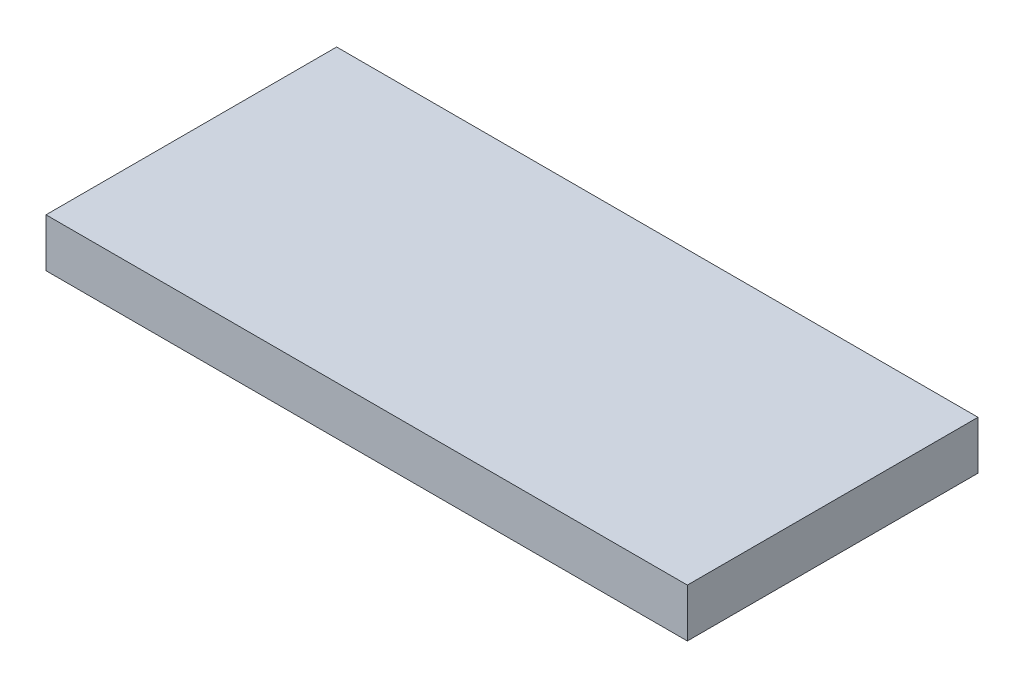
ISO-10303-21;
HEADER;
FILE_DESCRIPTION(('STEP AP214'),'2;1');
FILE_NAME('part.step','',(''),(''),'','','');
FILE_SCHEMA(('AUTOMOTIVE_DESIGN { 1 0 10303 214 1 1 1 1 }'));
ENDSEC;
DATA;
#1=APPLICATION_CONTEXT('core data for automotive mechanical design processes');
#2=APPLICATION_PROTOCOL_DEFINITION('international standard','automotive_design',2000,#1);
#3=PRODUCT_CONTEXT('',#1,'mechanical');
#4=PRODUCT('Part','Part','',(#3));
#5=PRODUCT_RELATED_PRODUCT_CATEGORY('part','',(#4));
#6=PRODUCT_DEFINITION_FORMATION('','',#4);
#7=PRODUCT_DEFINITION_CONTEXT('part definition',#1,'design');
#8=PRODUCT_DEFINITION('design','',#6,#7);
#9=PRODUCT_DEFINITION_SHAPE('','',#8);
#10=(LENGTH_UNIT() NAMED_UNIT(*) SI_UNIT(.MILLI.,.METRE.));
#11=(NAMED_UNIT(*) PLANE_ANGLE_UNIT() SI_UNIT($,.RADIAN.));
#12=(NAMED_UNIT(*) SI_UNIT($,.STERADIAN.) SOLID_ANGLE_UNIT());
#13=UNCERTAINTY_MEASURE_WITH_UNIT(LENGTH_MEASURE(1.E-05),#10,'distance_accuracy_value','');
#14=(GEOMETRIC_REPRESENTATION_CONTEXT(3) GLOBAL_UNCERTAINTY_ASSIGNED_CONTEXT((#13)) GLOBAL_UNIT_ASSIGNED_CONTEXT((#10,
#11,#12)) REPRESENTATION_CONTEXT('',''));
#15=CARTESIAN_POINT('',(0.,0.,0.));
#16=DIRECTION('',(0.,0.,1.));
#17=DIRECTION('',(1.,0.,0.));
#18=AXIS2_PLACEMENT_3D('',#15,#16,#17);
#19=CARTESIAN_POINT('',(0.,6.35,0.));
#20=DIRECTION('',(1.,0.,0.));
#21=DIRECTION('',(0.,0.,-1.));
#22=AXIS2_PLACEMENT_3D('',#19,#20,#21);
#23=PLANE('',#22);
#24=DIRECTION('',(0.,0.,1.));
#25=VECTOR('',#24,1.);
#26=CARTESIAN_POINT('',(0.,0.,0.));
#27=LINE('',#26,#25);
#28=CARTESIAN_POINT('',(0.,0.,0.));
#29=VERTEX_POINT('',#28);
#30=CARTESIAN_POINT('',(0.,0.,38.1));
#31=VERTEX_POINT('',#30);
#32=EDGE_CURVE('E96',#29,#31,#27,.T.);
#33=ORIENTED_EDGE('',*,*,#32,.T.);
#34=DIRECTION('',(0.,-1.,0.));
#35=VECTOR('',#34,1.);
#36=CARTESIAN_POINT('',(0.,6.35,38.1));
#37=LINE('',#36,#35);
#38=CARTESIAN_POINT('',(0.,6.35,38.1));
#39=VERTEX_POINT('',#38);
#40=EDGE_CURVE('E11',#39,#31,#37,.T.);
#41=ORIENTED_EDGE('',*,*,#40,.F.);
#42=DIRECTION('',(0.,0.,1.));
#43=VECTOR('',#42,1.);
#44=CARTESIAN_POINT('',(0.,6.35,0.));
#45=LINE('',#44,#43);
#46=CARTESIAN_POINT('',(0.,6.35,0.));
#47=VERTEX_POINT('',#46);
#48=EDGE_CURVE('E84',#47,#39,#45,.T.);
#49=ORIENTED_EDGE('',*,*,#48,.F.);
#50=DIRECTION('',(0.,-1.,0.));
#51=VECTOR('',#50,1.);
#52=CARTESIAN_POINT('',(0.,6.35,0.));
#53=LINE('',#52,#51);
#54=EDGE_CURVE('E92',#47,#29,#53,.T.);
#55=ORIENTED_EDGE('',*,*,#54,.T.);
#56=EDGE_LOOP('',(#33,#41,#49,#55));
#57=FACE_BOUND('',#56,.T.);
#58=ADVANCED_FACE('F33',(#57),#23,.F.);
#59=CARTESIAN_POINT('',(0.,6.35,38.1));
#60=DIRECTION('',(0.,0.,-1.));
#61=DIRECTION('',(-1.,0.,0.));
#62=AXIS2_PLACEMENT_3D('',#59,#60,#61);
#63=PLANE('',#62);
#64=DIRECTION('',(1.,0.,0.));
#65=VECTOR('',#64,1.);
#66=CARTESIAN_POINT('',(0.,0.,38.1));
#67=LINE('',#66,#65);
#68=CARTESIAN_POINT('',(84.074,0.,38.1));
#69=VERTEX_POINT('',#68);
#70=EDGE_CURVE('E88',#31,#69,#67,.T.);
#71=ORIENTED_EDGE('',*,*,#70,.T.);
#72=DIRECTION('',(0.,-1.,0.));
#73=VECTOR('',#72,1.);
#74=CARTESIAN_POINT('',(84.074,6.35,38.1));
#75=LINE('',#74,#73);
#76=CARTESIAN_POINT('',(84.074,6.35,38.1));
#77=VERTEX_POINT('',#76);
#78=EDGE_CURVE('E41',#77,#69,#75,.T.);
#79=ORIENTED_EDGE('',*,*,#78,.F.);
#80=DIRECTION('',(1.,0.,0.));
#81=VECTOR('',#80,1.);
#82=CARTESIAN_POINT('',(0.,6.35,38.1));
#83=LINE('',#82,#81);
#84=EDGE_CURVE('E79',#39,#77,#83,.T.);
#85=ORIENTED_EDGE('',*,*,#84,.F.);
#86=ORIENTED_EDGE('',*,*,#40,.T.);
#87=EDGE_LOOP('',(#71,#79,#85,#86));
#88=FACE_BOUND('',#87,.T.);
#89=ADVANCED_FACE('F87',(#88),#63,.F.);
#90=CARTESIAN_POINT('',(84.074,6.35,0.));
#91=DIRECTION('',(-1.,0.,0.));
#92=DIRECTION('',(0.,0.,1.));
#93=AXIS2_PLACEMENT_3D('',#90,#91,#92);
#94=PLANE('',#93);
#95=DIRECTION('',(0.,0.,-1.));
#96=VECTOR('',#95,1.);
#97=CARTESIAN_POINT('',(84.074,0.,0.));
#98=LINE('',#97,#96);
#99=CARTESIAN_POINT('',(84.074,0.,0.));
#100=VERTEX_POINT('',#99);
#101=EDGE_CURVE('E66',#69,#100,#98,.T.);
#102=ORIENTED_EDGE('',*,*,#101,.T.);
#103=DIRECTION('',(0.,-1.,0.));
#104=VECTOR('',#103,1.);
#105=CARTESIAN_POINT('',(84.074,6.35,0.));
#106=LINE('',#105,#104);
#107=CARTESIAN_POINT('',(84.074,6.35,0.));
#108=VERTEX_POINT('',#107);
#109=EDGE_CURVE('E89',#108,#100,#106,.T.);
#110=ORIENTED_EDGE('',*,*,#109,.F.);
#111=DIRECTION('',(0.,0.,-1.));
#112=VECTOR('',#111,1.);
#113=CARTESIAN_POINT('',(84.074,6.35,0.));
#114=LINE('',#113,#112);
#115=EDGE_CURVE('E82',#77,#108,#114,.T.);
#116=ORIENTED_EDGE('',*,*,#115,.F.);
#117=ORIENTED_EDGE('',*,*,#78,.T.);
#118=EDGE_LOOP('',(#102,#110,#116,#117));
#119=FACE_BOUND('',#118,.T.);
#120=ADVANCED_FACE('F90',(#119),#94,.F.);
#121=CARTESIAN_POINT('',(0.,6.35,0.));
#122=DIRECTION('',(0.,0.,1.));
#123=DIRECTION('',(1.,0.,0.));
#124=AXIS2_PLACEMENT_3D('',#121,#122,#123);
#125=PLANE('',#124);
#126=DIRECTION('',(-1.,0.,0.));
#127=VECTOR('',#126,1.);
#128=CARTESIAN_POINT('',(0.,0.,0.));
#129=LINE('',#128,#127);
#130=EDGE_CURVE('E72',#100,#29,#129,.T.);
#131=ORIENTED_EDGE('',*,*,#130,.T.);
#132=ORIENTED_EDGE('',*,*,#54,.F.);
#133=DIRECTION('',(-1.,0.,0.));
#134=VECTOR('',#133,1.);
#135=CARTESIAN_POINT('',(0.,6.35,0.));
#136=LINE('',#135,#134);
#137=EDGE_CURVE('E49',#108,#47,#136,.T.);
#138=ORIENTED_EDGE('',*,*,#137,.F.);
#139=ORIENTED_EDGE('',*,*,#109,.T.);
#140=EDGE_LOOP('',(#131,#132,#138,#139));
#141=FACE_BOUND('',#140,.T.);
#142=ADVANCED_FACE('F103',(#141),#125,.F.);
#143=CARTESIAN_POINT('',(0.,6.35,0.));
#144=DIRECTION('',(0.,1.,0.));
#145=DIRECTION('',(0.,0.,1.));
#146=AXIS2_PLACEMENT_3D('',#143,#144,#145);
#147=PLANE('',#146);
#148=ORIENTED_EDGE('',*,*,#48,.T.);
#149=ORIENTED_EDGE('',*,*,#84,.T.);
#150=ORIENTED_EDGE('',*,*,#115,.T.);
#151=ORIENTED_EDGE('',*,*,#137,.T.);
#152=EDGE_LOOP('',(#148,#149,#150,#151));
#153=FACE_BOUND('',#152,.T.);
#154=ADVANCED_FACE('F80',(#153),#147,.T.);
#155=CARTESIAN_POINT('',(0.,0.,0.));
#156=DIRECTION('',(0.,1.,0.));
#157=DIRECTION('',(0.,0.,1.));
#158=AXIS2_PLACEMENT_3D('',#155,#156,#157);
#159=PLANE('',#158);
#160=ORIENTED_EDGE('',*,*,#32,.F.);
#161=ORIENTED_EDGE('',*,*,#130,.F.);
#162=ORIENTED_EDGE('',*,*,#101,.F.);
#163=ORIENTED_EDGE('',*,*,#70,.F.);
#164=EDGE_LOOP('',(#160,#161,#162,#163));
#165=FACE_BOUND('',#164,.T.);
#166=ADVANCED_FACE('F106',(#165),#159,.F.);
#167=CLOSED_SHELL('',(#58,#89,#120,#142,#154,#166));
#168=MANIFOLD_SOLID_BREP('B2',#167);
#169=ADVANCED_BREP_SHAPE_REPRESENTATION('',(#18,#168),#14);
#170=SHAPE_DEFINITION_REPRESENTATION(#9,#169);
ENDSEC;
END-ISO-10303-21;
